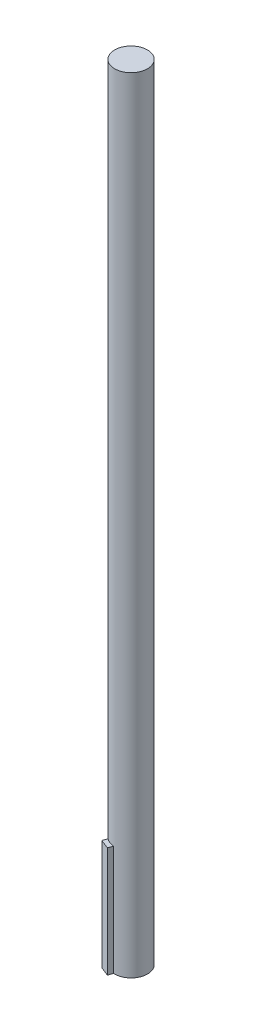
ISO-10303-21;
HEADER;
FILE_DESCRIPTION(('STEP AP214'),'2;1');
FILE_NAME('part.step','',(''),(''),'','','');
FILE_SCHEMA(('AUTOMOTIVE_DESIGN { 1 0 10303 214 1 1 1 1 }'));
ENDSEC;
DATA;
#1=APPLICATION_CONTEXT('core data for automotive mechanical design processes');
#2=APPLICATION_PROTOCOL_DEFINITION('international standard','automotive_design',2000,#1);
#3=PRODUCT_CONTEXT('',#1,'mechanical');
#4=PRODUCT('Part','Part','',(#3));
#5=PRODUCT_RELATED_PRODUCT_CATEGORY('part','',(#4));
#6=PRODUCT_DEFINITION_FORMATION('','',#4);
#7=PRODUCT_DEFINITION_CONTEXT('part definition',#1,'design');
#8=PRODUCT_DEFINITION('design','',#6,#7);
#9=PRODUCT_DEFINITION_SHAPE('','',#8);
#10=(LENGTH_UNIT() NAMED_UNIT(*) SI_UNIT(.MILLI.,.METRE.));
#11=(NAMED_UNIT(*) PLANE_ANGLE_UNIT() SI_UNIT($,.RADIAN.));
#12=(NAMED_UNIT(*) SI_UNIT($,.STERADIAN.) SOLID_ANGLE_UNIT());
#13=UNCERTAINTY_MEASURE_WITH_UNIT(LENGTH_MEASURE(1.E-05),#10,'distance_accuracy_value','');
#14=(GEOMETRIC_REPRESENTATION_CONTEXT(3) GLOBAL_UNCERTAINTY_ASSIGNED_CONTEXT((#13)) GLOBAL_UNIT_ASSIGNED_CONTEXT((#10,
#11,#12)) REPRESENTATION_CONTEXT('',''));
#15=CARTESIAN_POINT('',(0.,0.,0.));
#16=DIRECTION('',(0.,0.,1.));
#17=DIRECTION('',(1.,0.,0.));
#18=AXIS2_PLACEMENT_3D('',#15,#16,#17);
#19=CARTESIAN_POINT('',(0.,90.,0.));
#20=DIRECTION('',(0.,-1.,0.));
#21=DIRECTION('',(0.,0.,-1.));
#22=AXIS2_PLACEMENT_3D('',#19,#20,#21);
#23=CYLINDRICAL_SURFACE('',#22,13.368580060423);
#24=CARTESIAN_POINT('',(0.,0.,0.));
#25=DIRECTION('',(0.,1.,0.));
#26=DIRECTION('',(0.,0.,1.));
#27=AXIS2_PLACEMENT_3D('',#24,#25,#26);
#28=CIRCLE('',#27,13.368580060423);
#29=CARTESIAN_POINT('',(-0.832718515195952,0.,13.3426201589639));
#30=VERTEX_POINT('',#29);
#31=CARTESIAN_POINT('',(-8.30229602691756,0.,10.4781111615295));
#32=VERTEX_POINT('',#31);
#33=EDGE_CURVE('E96',#30,#32,#28,.T.);
#34=ORIENTED_EDGE('',*,*,#33,.T.);
#35=DIRECTION('',(0.,-1.,0.));
#36=VECTOR('',#35,1.);
#37=CARTESIAN_POINT('',(-8.30229602691756,90.,10.4781111615295));
#38=LINE('',#37,#36);
#39=CARTESIAN_POINT('',(-8.30229602691756,90.,10.4781111615295));
#40=VERTEX_POINT('',#39);
#41=EDGE_CURVE('E11',#40,#32,#38,.T.);
#42=ORIENTED_EDGE('',*,*,#41,.F.);
#43=CARTESIAN_POINT('',(0.,90.,0.));
#44=DIRECTION('',(0.,1.,0.));
#45=DIRECTION('',(0.,0.,1.));
#46=AXIS2_PLACEMENT_3D('',#43,#44,#45);
#47=CIRCLE('',#46,13.368580060423);
#48=CARTESIAN_POINT('',(-0.832718515195952,90.,13.3426201589639));
#49=VERTEX_POINT('',#48);
#50=EDGE_CURVE('E94',#40,#49,#47,.T.);
#51=ORIENTED_EDGE('',*,*,#50,.T.);
#52=DIRECTION('',(0.,-1.,0.));
#53=VECTOR('',#52,1.);
#54=CARTESIAN_POINT('',(-0.832718515195952,90.,13.3426201589639));
#55=LINE('',#54,#53);
#56=EDGE_CURVE('E115',#49,#30,#55,.T.);
#57=ORIENTED_EDGE('',*,*,#56,.T.);
#58=EDGE_LOOP('',(#34,#42,#51,#57));
#59=FACE_BOUND('',#58,.T.);
#60=CARTESIAN_POINT('',(0.,640.,0.));
#61=DIRECTION('',(0.,1.,0.));
#62=DIRECTION('',(0.,0.,1.));
#63=AXIS2_PLACEMENT_3D('',#60,#61,#62);
#64=CIRCLE('',#63,13.368580060423);
#65=CARTESIAN_POINT('',(0.,640.,13.368580060423));
#66=VERTEX_POINT('',#65);
#67=EDGE_CURVE('E105',#66,#66,#64,.T.);
#68=ORIENTED_EDGE('',*,*,#67,.F.);
#69=EDGE_LOOP('',(#68));
#70=FACE_BOUND('',#69,.T.);
#71=ADVANCED_FACE('F42',(#59,#70),#23,.T.);
#72=CARTESIAN_POINT('',(-9.73455052563476,90.,14.2128999173903));
#73=DIRECTION('',(0.933697188965202,0.,0.3580636246793));
#74=DIRECTION('',(0.3580636246793,0.,-0.933697188965203));
#75=AXIS2_PLACEMENT_3D('',#72,#73,#74);
#76=PLANE('',#75);
#77=DIRECTION('',(-0.3580636246793,0.,0.933697188965203));
#78=VECTOR('',#77,1.);
#79=CARTESIAN_POINT('',(-9.73455052563476,0.,14.2128999173903));
#80=LINE('',#79,#78);
#81=CARTESIAN_POINT('',(-9.73455052563476,0.,14.2128999173903));
#82=VERTEX_POINT('',#81);
#83=EDGE_CURVE('E118',#32,#82,#80,.T.);
#84=ORIENTED_EDGE('',*,*,#83,.T.);
#85=DIRECTION('',(0.,-1.,0.));
#86=VECTOR('',#85,1.);
#87=CARTESIAN_POINT('',(-9.73455052563476,90.,14.2128999173903));
#88=LINE('',#87,#86);
#89=CARTESIAN_POINT('',(-9.73455052563476,90.,14.2128999173903));
#90=VERTEX_POINT('',#89);
#91=EDGE_CURVE('E51',#90,#82,#88,.T.);
#92=ORIENTED_EDGE('',*,*,#91,.F.);
#93=DIRECTION('',(-0.3580636246793,0.,0.933697188965203));
#94=VECTOR('',#93,1.);
#95=CARTESIAN_POINT('',(-9.73455052563476,90.,14.2128999173903));
#96=LINE('',#95,#94);
#97=EDGE_CURVE('E86',#40,#90,#96,.T.);
#98=ORIENTED_EDGE('',*,*,#97,.F.);
#99=ORIENTED_EDGE('',*,*,#41,.T.);
#100=EDGE_LOOP('',(#84,#92,#98,#99));
#101=FACE_BOUND('',#100,.T.);
#102=ADVANCED_FACE('F98',(#101),#76,.F.);
#103=CARTESIAN_POINT('',(-2.26497301391314,90.,17.0774089148247));
#104=DIRECTION('',(0.3580636246793,0.,-0.933697188965203));
#105=DIRECTION('',(-0.933697188965203,0.,-0.3580636246793));
#106=AXIS2_PLACEMENT_3D('',#103,#104,#105);
#107=PLANE('',#106);
#108=DIRECTION('',(0.933697188965203,0.,0.3580636246793));
#109=VECTOR('',#108,1.);
#110=CARTESIAN_POINT('',(-2.26497301391314,0.,17.0774089148247));
#111=LINE('',#110,#109);
#112=CARTESIAN_POINT('',(-2.26497301391314,0.,17.0774089148247));
#113=VERTEX_POINT('',#112);
#114=EDGE_CURVE('E77',#82,#113,#111,.T.);
#115=ORIENTED_EDGE('',*,*,#114,.T.);
#116=DIRECTION('',(0.,-1.,0.));
#117=VECTOR('',#116,1.);
#118=CARTESIAN_POINT('',(-2.26497301391314,90.,17.0774089148247));
#119=LINE('',#118,#117);
#120=CARTESIAN_POINT('',(-2.26497301391314,90.,17.0774089148247));
#121=VERTEX_POINT('',#120);
#122=EDGE_CURVE('E127',#121,#113,#119,.T.);
#123=ORIENTED_EDGE('',*,*,#122,.F.);
#124=DIRECTION('',(0.933697188965203,0.,0.3580636246793));
#125=VECTOR('',#124,1.);
#126=CARTESIAN_POINT('',(-2.26497301391314,90.,17.0774089148247));
#127=LINE('',#126,#125);
#128=EDGE_CURVE('E101',#90,#121,#127,.T.);
#129=ORIENTED_EDGE('',*,*,#128,.F.);
#130=ORIENTED_EDGE('',*,*,#91,.T.);
#131=EDGE_LOOP('',(#115,#123,#129,#130));
#132=FACE_BOUND('',#131,.T.);
#133=ADVANCED_FACE('F130',(#132),#107,.F.);
#134=CARTESIAN_POINT('',(-0.832718515195952,90.,13.3426201589639));
#135=DIRECTION('',(-0.933697188965203,0.,-0.3580636246793));
#136=DIRECTION('',(-0.3580636246793,0.,0.933697188965203));
#137=AXIS2_PLACEMENT_3D('',#134,#135,#136);
#138=PLANE('',#137);
#139=DIRECTION('',(0.3580636246793,0.,-0.933697188965203));
#140=VECTOR('',#139,1.);
#141=CARTESIAN_POINT('',(-0.832718515195952,0.,13.3426201589639));
#142=LINE('',#141,#140);
#143=EDGE_CURVE('E82',#113,#30,#142,.T.);
#144=ORIENTED_EDGE('',*,*,#143,.T.);
#145=ORIENTED_EDGE('',*,*,#56,.F.);
#146=DIRECTION('',(0.3580636246793,0.,-0.933697188965203));
#147=VECTOR('',#146,1.);
#148=CARTESIAN_POINT('',(-0.832718515195952,90.,13.3426201589639));
#149=LINE('',#148,#147);
#150=EDGE_CURVE('E59',#121,#49,#149,.T.);
#151=ORIENTED_EDGE('',*,*,#150,.F.);
#152=ORIENTED_EDGE('',*,*,#122,.T.);
#153=EDGE_LOOP('',(#144,#145,#151,#152));
#154=FACE_BOUND('',#153,.T.);
#155=ADVANCED_FACE('F142',(#154),#138,.F.);
#156=CARTESIAN_POINT('',(0.,90.,0.));
#157=DIRECTION('',(0.,1.,0.));
#158=DIRECTION('',(0.,0.,1.));
#159=AXIS2_PLACEMENT_3D('',#156,#157,#158);
#160=PLANE('',#159);
#161=ORIENTED_EDGE('',*,*,#50,.F.);
#162=ORIENTED_EDGE('',*,*,#97,.T.);
#163=ORIENTED_EDGE('',*,*,#128,.T.);
#164=ORIENTED_EDGE('',*,*,#150,.T.);
#165=EDGE_LOOP('',(#161,#162,#163,#164));
#166=FACE_BOUND('',#165,.T.);
#167=ADVANCED_FACE('F103',(#166),#160,.T.);
#168=CARTESIAN_POINT('',(0.,0.,0.));
#169=DIRECTION('',(0.,1.,0.));
#170=DIRECTION('',(0.,0.,1.));
#171=AXIS2_PLACEMENT_3D('',#168,#169,#170);
#172=PLANE('',#171);
#173=ORIENTED_EDGE('',*,*,#33,.F.);
#174=ORIENTED_EDGE('',*,*,#143,.F.);
#175=ORIENTED_EDGE('',*,*,#114,.F.);
#176=ORIENTED_EDGE('',*,*,#83,.F.);
#177=EDGE_LOOP('',(#173,#174,#175,#176));
#178=FACE_BOUND('',#177,.T.);
#179=ADVANCED_FACE('F132',(#178),#172,.F.);
#180=CARTESIAN_POINT('',(0.,640.,0.));
#181=DIRECTION('',(0.,1.,0.));
#182=DIRECTION('',(0.,0.,1.));
#183=AXIS2_PLACEMENT_3D('',#180,#181,#182);
#184=PLANE('',#183);
#185=ORIENTED_EDGE('',*,*,#67,.T.);
#186=EDGE_LOOP('',(#185));
#187=FACE_BOUND('',#186,.T.);
#188=ADVANCED_FACE('F134',(#187),#184,.T.);
#189=CLOSED_SHELL('',(#71,#102,#133,#155,#167,#179,#188));
#190=MANIFOLD_SOLID_BREP('B2',#189);
#191=ADVANCED_BREP_SHAPE_REPRESENTATION('',(#18,#190),#14);
#192=SHAPE_DEFINITION_REPRESENTATION(#9,#191);
ENDSEC;
END-ISO-10303-21;
